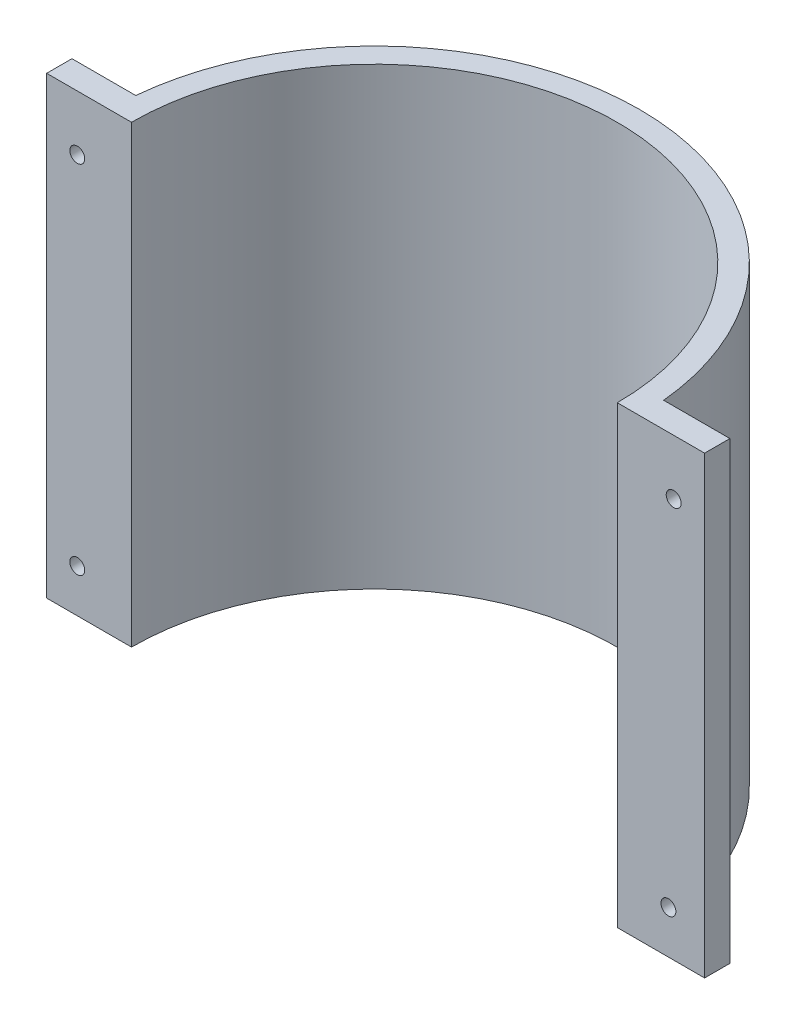
ISO-10303-21;
HEADER;
FILE_DESCRIPTION(('STEP AP214'),'2;1');
FILE_NAME('part.step','',(''),(''),'','','');
FILE_SCHEMA(('AUTOMOTIVE_DESIGN { 1 0 10303 214 1 1 1 1 }'));
ENDSEC;
DATA;
#1=APPLICATION_CONTEXT('core data for automotive mechanical design processes');
#2=APPLICATION_PROTOCOL_DEFINITION('international standard','automotive_design',2000,#1);
#3=PRODUCT_CONTEXT('',#1,'mechanical');
#4=PRODUCT('Part','Part','',(#3));
#5=PRODUCT_RELATED_PRODUCT_CATEGORY('part','',(#4));
#6=PRODUCT_DEFINITION_FORMATION('','',#4);
#7=PRODUCT_DEFINITION_CONTEXT('part definition',#1,'design');
#8=PRODUCT_DEFINITION('design','',#6,#7);
#9=PRODUCT_DEFINITION_SHAPE('','',#8);
#10=(LENGTH_UNIT() NAMED_UNIT(*) SI_UNIT(.MILLI.,.METRE.));
#11=(NAMED_UNIT(*) PLANE_ANGLE_UNIT() SI_UNIT($,.RADIAN.));
#12=(NAMED_UNIT(*) SI_UNIT($,.STERADIAN.) SOLID_ANGLE_UNIT());
#13=UNCERTAINTY_MEASURE_WITH_UNIT(LENGTH_MEASURE(1.E-05),#10,'distance_accuracy_value','');
#14=(GEOMETRIC_REPRESENTATION_CONTEXT(3) GLOBAL_UNCERTAINTY_ASSIGNED_CONTEXT((#13)) GLOBAL_UNIT_ASSIGNED_CONTEXT((#10,
#11,#12)) REPRESENTATION_CONTEXT('',''));
#15=CARTESIAN_POINT('',(0.,0.,0.));
#16=DIRECTION('',(0.,0.,1.));
#17=DIRECTION('',(1.,0.,0.));
#18=AXIS2_PLACEMENT_3D('',#15,#16,#17);
#19=CARTESIAN_POINT('',(0.,76.2,0.));
#20=DIRECTION('',(0.,0.,-1.));
#21=DIRECTION('',(-1.,0.,0.));
#22=AXIS2_PLACEMENT_3D('',#19,#20,#21);
#23=PLANE('',#22);
#24=CARTESIAN_POINT('',(50.1718812238547,66.9453906654637,0.));
#25=DIRECTION('',(0.,0.,-1.));
#26=DIRECTION('',(-1.,0.,0.));
#27=AXIS2_PLACEMENT_3D('',#24,#25,#26);
#28=CIRCLE('',#27,1.25);
#29=CARTESIAN_POINT('',(48.9218812238547,66.9453906654637,0.));
#30=VERTEX_POINT('',#29);
#31=EDGE_CURVE('E238',#30,#30,#28,.T.);
#32=ORIENTED_EDGE('',*,*,#31,.T.);
#33=EDGE_LOOP('',(#32));
#34=FACE_BOUND('',#33,.T.);
#35=CARTESIAN_POINT('',(49.2913811461701,7.23147630612247,0.));
#36=DIRECTION('',(0.,0.,-1.));
#37=DIRECTION('',(-1.,0.,0.));
#38=AXIS2_PLACEMENT_3D('',#35,#36,#37);
#39=CIRCLE('',#38,1.25);
#40=CARTESIAN_POINT('',(48.0413811461701,7.23147630612247,0.));
#41=VERTEX_POINT('',#40);
#42=EDGE_CURVE('E226',#41,#41,#39,.T.);
#43=ORIENTED_EDGE('',*,*,#42,.T.);
#44=EDGE_LOOP('',(#43));
#45=FACE_BOUND('',#44,.T.);
#46=DIRECTION('',(1.,0.,0.));
#47=VECTOR('',#46,1.);
#48=CARTESIAN_POINT('',(0.,0.,0.));
#49=LINE('',#48,#47);
#50=CARTESIAN_POINT('',(40.716846583291,0.,0.));
#51=VERTEX_POINT('',#50);
#52=CARTESIAN_POINT('',(55.3595794015159,0.,0.));
#53=VERTEX_POINT('',#52);
#54=EDGE_CURVE('E108',#51,#53,#49,.T.);
#55=ORIENTED_EDGE('',*,*,#54,.T.);
#56=DIRECTION('',(0.,-1.,0.));
#57=VECTOR('',#56,1.);
#58=CARTESIAN_POINT('',(55.3595794015159,76.2,0.));
#59=LINE('',#58,#57);
#60=CARTESIAN_POINT('',(55.3595794015159,76.2,0.));
#61=VERTEX_POINT('',#60);
#62=EDGE_CURVE('E111',#61,#53,#59,.T.);
#63=ORIENTED_EDGE('',*,*,#62,.F.);
#64=DIRECTION('',(1.,0.,0.));
#65=VECTOR('',#64,1.);
#66=CARTESIAN_POINT('',(0.,76.2,0.));
#67=LINE('',#66,#65);
#68=CARTESIAN_POINT('',(40.716846583291,76.2,0.));
#69=VERTEX_POINT('',#68);
#70=EDGE_CURVE('E163',#69,#61,#67,.T.);
#71=ORIENTED_EDGE('',*,*,#70,.F.);
#72=DIRECTION('',(0.,-1.,0.));
#73=VECTOR('',#72,1.);
#74=CARTESIAN_POINT('',(40.716846583291,76.2,0.));
#75=LINE('',#74,#73);
#76=EDGE_CURVE('E115',#69,#51,#75,.T.);
#77=ORIENTED_EDGE('',*,*,#76,.T.);
#78=EDGE_LOOP('',(#55,#63,#71,#77));
#79=FACE_BOUND('',#78,.T.);
#80=ADVANCED_FACE('F69',(#34,#45,#79),#23,.F.);
#81=CARTESIAN_POINT('',(0.,76.2,0.));
#82=DIRECTION('',(0.,-1.,0.));
#83=DIRECTION('',(0.,0.,-1.));
#84=AXIS2_PLACEMENT_3D('',#81,#82,#83);
#85=CYLINDRICAL_SURFACE('',#84,44.45);
#86=CARTESIAN_POINT('',(0.,76.2,0.));
#87=DIRECTION('',(0.,1.,0.));
#88=DIRECTION('',(0.,0.,1.));
#89=AXIS2_PLACEMENT_3D('',#86,#87,#88);
#90=CIRCLE('',#89,44.45);
#91=CARTESIAN_POINT('',(44.2472010788638,76.2,-4.24119047987651));
#92=VERTEX_POINT('',#91);
#93=CARTESIAN_POINT('',(-44.2472010788638,76.2,-4.24119047987651));
#94=VERTEX_POINT('',#93);
#95=EDGE_CURVE('E119',#92,#94,#90,.T.);
#96=ORIENTED_EDGE('',*,*,#95,.F.);
#97=DIRECTION('',(0.,-1.,0.));
#98=VECTOR('',#97,1.);
#99=CARTESIAN_POINT('',(44.2472010788638,76.2,-4.2411904798765));
#100=LINE('',#99,#98);
#101=CARTESIAN_POINT('',(44.2472010788638,0.,-4.24119047987651));
#102=VERTEX_POINT('',#101);
#103=EDGE_CURVE('E12',#92,#102,#100,.T.);
#104=ORIENTED_EDGE('',*,*,#103,.T.);
#105=CARTESIAN_POINT('',(0.,0.,0.));
#106=DIRECTION('',(0.,1.,0.));
#107=DIRECTION('',(0.,0.,1.));
#108=AXIS2_PLACEMENT_3D('',#105,#106,#107);
#109=CIRCLE('',#108,44.45);
#110=CARTESIAN_POINT('',(-44.2472010788638,0.,-4.24119047987651));
#111=VERTEX_POINT('',#110);
#112=EDGE_CURVE('E130',#102,#111,#109,.T.);
#113=ORIENTED_EDGE('',*,*,#112,.T.);
#114=DIRECTION('',(0.,-1.,0.));
#115=VECTOR('',#114,1.);
#116=CARTESIAN_POINT('',(-44.2472010788638,76.2,-4.24119047987651));
#117=LINE('',#116,#115);
#118=EDGE_CURVE('E79',#94,#111,#117,.T.);
#119=ORIENTED_EDGE('',*,*,#118,.F.);
#120=EDGE_LOOP('',(#96,#104,#113,#119));
#121=FACE_BOUND('',#120,.T.);
#122=ADVANCED_FACE('F274',(#121),#85,.T.);
#123=CARTESIAN_POINT('',(0.,76.2,-4.24119047987651));
#124=DIRECTION('',(0.,0.,1.));
#125=DIRECTION('',(1.,0.,0.));
#126=AXIS2_PLACEMENT_3D('',#123,#124,#125);
#127=PLANE('',#126);
#128=CARTESIAN_POINT('',(-49.8049003241577,7.23147630612247,-4.24119047987651));
#129=DIRECTION('',(0.,0.,-1.));
#130=DIRECTION('',(-1.,0.,0.));
#131=AXIS2_PLACEMENT_3D('',#128,#129,#130);
#132=CIRCLE('',#131,1.275);
#133=CARTESIAN_POINT('',(-51.0799003241577,7.23147630612247,-4.24119047987651));
#134=VERTEX_POINT('',#133);
#135=EDGE_CURVE('E222',#134,#134,#132,.T.);
#136=ORIENTED_EDGE('',*,*,#135,.F.);
#137=EDGE_LOOP('',(#136));
#138=FACE_BOUND('',#137,.T.);
#139=CARTESIAN_POINT('',(-49.8049003241577,66.9453906654637,-4.24119047987651));
#140=DIRECTION('',(0.,0.,-1.));
#141=DIRECTION('',(-1.,0.,0.));
#142=AXIS2_PLACEMENT_3D('',#139,#140,#141);
#143=CIRCLE('',#142,1.275);
#144=CARTESIAN_POINT('',(-51.0799003241577,66.9453906654637,-4.24119047987651));
#145=VERTEX_POINT('',#144);
#146=EDGE_CURVE('E210',#145,#145,#143,.T.);
#147=ORIENTED_EDGE('',*,*,#146,.F.);
#148=EDGE_LOOP('',(#147));
#149=FACE_BOUND('',#148,.T.);
#150=DIRECTION('',(-1.,0.,0.));
#151=VECTOR('',#150,1.);
#152=CARTESIAN_POINT('',(0.,0.,-4.24119047987651));
#153=LINE('',#152,#151);
#154=CARTESIAN_POINT('',(-54.9362177945739,0.,-4.24119047987651));
#155=VERTEX_POINT('',#154);
#156=EDGE_CURVE('E175',#111,#155,#153,.T.);
#157=ORIENTED_EDGE('',*,*,#156,.T.);
#158=DIRECTION('',(0.,-1.,0.));
#159=VECTOR('',#158,1.);
#160=CARTESIAN_POINT('',(-54.9362177945739,76.2,-4.24119047987651));
#161=LINE('',#160,#159);
#162=CARTESIAN_POINT('',(-54.9362177945739,76.2,-4.24119047987651));
#163=VERTEX_POINT('',#162);
#164=EDGE_CURVE('E150',#163,#155,#161,.T.);
#165=ORIENTED_EDGE('',*,*,#164,.F.);
#166=DIRECTION('',(-1.,0.,0.));
#167=VECTOR('',#166,1.);
#168=CARTESIAN_POINT('',(0.,76.2,-4.24119047987651));
#169=LINE('',#168,#167);
#170=EDGE_CURVE('E196',#94,#163,#169,.T.);
#171=ORIENTED_EDGE('',*,*,#170,.F.);
#172=ORIENTED_EDGE('',*,*,#118,.T.);
#173=EDGE_LOOP('',(#157,#165,#171,#172));
#174=FACE_BOUND('',#173,.T.);
#175=ADVANCED_FACE('F276',(#138,#149,#174),#127,.F.);
#176=CARTESIAN_POINT('',(-54.9362177945739,76.2,0.));
#177=DIRECTION('',(-1.,0.,0.));
#178=DIRECTION('',(0.,0.,1.));
#179=AXIS2_PLACEMENT_3D('',#176,#177,#178);
#180=PLANE('',#179);
#181=DIRECTION('',(0.,0.,-1.));
#182=VECTOR('',#181,1.);
#183=CARTESIAN_POINT('',(-54.9362177945739,0.,0.));
#184=LINE('',#183,#182);
#185=CARTESIAN_POINT('',(-54.9362177945739,0.,0.));
#186=VERTEX_POINT('',#185);
#187=EDGE_CURVE('E171',#186,#155,#184,.T.);
#188=ORIENTED_EDGE('',*,*,#187,.F.);
#189=DIRECTION('',(0.,-1.,0.));
#190=VECTOR('',#189,1.);
#191=CARTESIAN_POINT('',(-54.9362177945739,76.2,0.));
#192=LINE('',#191,#190);
#193=CARTESIAN_POINT('',(-54.9362177945739,76.2,0.));
#194=VERTEX_POINT('',#193);
#195=EDGE_CURVE('E154',#194,#186,#192,.T.);
#196=ORIENTED_EDGE('',*,*,#195,.F.);
#197=DIRECTION('',(0.,0.,-1.));
#198=VECTOR('',#197,1.);
#199=CARTESIAN_POINT('',(-54.9362177945739,76.2,0.));
#200=LINE('',#199,#198);
#201=EDGE_CURVE('E192',#194,#163,#200,.T.);
#202=ORIENTED_EDGE('',*,*,#201,.T.);
#203=ORIENTED_EDGE('',*,*,#164,.T.);
#204=EDGE_LOOP('',(#188,#196,#202,#203));
#205=FACE_BOUND('',#204,.T.);
#206=ADVANCED_FACE('F283',(#205),#180,.T.);
#207=CARTESIAN_POINT('',(0.,76.2,0.));
#208=DIRECTION('',(0.,0.,-1.));
#209=DIRECTION('',(-1.,0.,0.));
#210=AXIS2_PLACEMENT_3D('',#207,#208,#209);
#211=PLANE('',#210);
#212=CARTESIAN_POINT('',(-49.8049003241577,7.23147630612247,0.));
#213=DIRECTION('',(0.,0.,-1.));
#214=DIRECTION('',(-1.,0.,0.));
#215=AXIS2_PLACEMENT_3D('',#212,#213,#214);
#216=CIRCLE('',#215,1.25);
#217=CARTESIAN_POINT('',(-51.0549003241577,7.23147630612247,0.));
#218=VERTEX_POINT('',#217);
#219=EDGE_CURVE('E214',#218,#218,#216,.T.);
#220=ORIENTED_EDGE('',*,*,#219,.T.);
#221=EDGE_LOOP('',(#220));
#222=FACE_BOUND('',#221,.T.);
#223=CARTESIAN_POINT('',(-49.8049003241577,66.9453906654637,0.));
#224=DIRECTION('',(0.,0.,-1.));
#225=DIRECTION('',(-1.,0.,0.));
#226=AXIS2_PLACEMENT_3D('',#223,#224,#225);
#227=CIRCLE('',#226,1.25);
#228=CARTESIAN_POINT('',(-51.0549003241577,66.9453906654637,0.));
#229=VERTEX_POINT('',#228);
#230=EDGE_CURVE('E140',#229,#229,#227,.T.);
#231=ORIENTED_EDGE('',*,*,#230,.T.);
#232=EDGE_LOOP('',(#231));
#233=FACE_BOUND('',#232,.T.);
#234=DIRECTION('',(1.,0.,0.));
#235=VECTOR('',#234,1.);
#236=CARTESIAN_POINT('',(0.,0.,0.));
#237=LINE('',#236,#235);
#238=CARTESIAN_POINT('',(-40.716846583291,0.,0.));
#239=VERTEX_POINT('',#238);
#240=EDGE_CURVE('E167',#186,#239,#237,.T.);
#241=ORIENTED_EDGE('',*,*,#240,.T.);
#242=DIRECTION('',(0.,-1.,0.));
#243=VECTOR('',#242,1.);
#244=CARTESIAN_POINT('',(-40.716846583291,76.2,0.));
#245=LINE('',#244,#243);
#246=CARTESIAN_POINT('',(-40.716846583291,76.2,0.));
#247=VERTEX_POINT('',#246);
#248=EDGE_CURVE('E158',#247,#239,#245,.T.);
#249=ORIENTED_EDGE('',*,*,#248,.F.);
#250=DIRECTION('',(1.,0.,0.));
#251=VECTOR('',#250,1.);
#252=CARTESIAN_POINT('',(0.,76.2,0.));
#253=LINE('',#252,#251);
#254=EDGE_CURVE('E188',#194,#247,#253,.T.);
#255=ORIENTED_EDGE('',*,*,#254,.F.);
#256=ORIENTED_EDGE('',*,*,#195,.T.);
#257=EDGE_LOOP('',(#241,#249,#255,#256));
#258=FACE_BOUND('',#257,.T.);
#259=ADVANCED_FACE('F307',(#222,#233,#258),#211,.F.);
#260=CARTESIAN_POINT('',(0.,76.2,0.));
#261=DIRECTION('',(0.,-1.,0.));
#262=DIRECTION('',(0.,0.,-1.));
#263=AXIS2_PLACEMENT_3D('',#260,#261,#262);
#264=CYLINDRICAL_SURFACE('',#263,40.716846583291);
#265=CARTESIAN_POINT('',(0.,0.,0.));
#266=DIRECTION('',(0.,1.,0.));
#267=DIRECTION('',(0.,0.,1.));
#268=AXIS2_PLACEMENT_3D('',#265,#266,#267);
#269=CIRCLE('',#268,40.716846583291);
#270=EDGE_CURVE('E120',#51,#239,#269,.T.);
#271=ORIENTED_EDGE('',*,*,#270,.F.);
#272=ORIENTED_EDGE('',*,*,#76,.F.);
#273=CARTESIAN_POINT('',(0.,76.2,0.));
#274=DIRECTION('',(0.,1.,0.));
#275=DIRECTION('',(0.,0.,1.));
#276=AXIS2_PLACEMENT_3D('',#273,#274,#275);
#277=CIRCLE('',#276,40.716846583291);
#278=EDGE_CURVE('E184',#69,#247,#277,.T.);
#279=ORIENTED_EDGE('',*,*,#278,.T.);
#280=ORIENTED_EDGE('',*,*,#248,.T.);
#281=EDGE_LOOP('',(#271,#272,#279,#280));
#282=FACE_BOUND('',#281,.T.);
#283=ADVANCED_FACE('F299',(#282),#264,.F.);
#284=CARTESIAN_POINT('',(0.,0.,0.));
#285=DIRECTION('',(0.,1.,0.));
#286=DIRECTION('',(0.,0.,1.));
#287=AXIS2_PLACEMENT_3D('',#284,#285,#286);
#288=PLANE('',#287);
#289=ORIENTED_EDGE('',*,*,#112,.F.);
#290=DIRECTION('',(1.,0.,0.));
#291=VECTOR('',#290,1.);
#292=CARTESIAN_POINT('',(40.716846583291,0.,-4.24119047987651));
#293=LINE('',#292,#291);
#294=CARTESIAN_POINT('',(55.3595794015159,0.,-4.24119047987651));
#295=VERTEX_POINT('',#294);
#296=EDGE_CURVE('E101',#102,#295,#293,.T.);
#297=ORIENTED_EDGE('',*,*,#296,.T.);
#298=DIRECTION('',(0.,0.,-1.));
#299=VECTOR('',#298,1.);
#300=CARTESIAN_POINT('',(55.3595794015159,0.,0.));
#301=LINE('',#300,#299);
#302=EDGE_CURVE('E126',#53,#295,#301,.T.);
#303=ORIENTED_EDGE('',*,*,#302,.F.);
#304=ORIENTED_EDGE('',*,*,#54,.F.);
#305=ORIENTED_EDGE('',*,*,#270,.T.);
#306=ORIENTED_EDGE('',*,*,#240,.F.);
#307=ORIENTED_EDGE('',*,*,#187,.T.);
#308=ORIENTED_EDGE('',*,*,#156,.F.);
#309=EDGE_LOOP('',(#289,#297,#303,#304,#305,#306,#307,#308));
#310=FACE_BOUND('',#309,.T.);
#311=ADVANCED_FACE('F133',(#310),#288,.F.);
#312=CARTESIAN_POINT('',(0.,76.2,0.));
#313=DIRECTION('',(0.,1.,0.));
#314=DIRECTION('',(0.,0.,1.));
#315=AXIS2_PLACEMENT_3D('',#312,#313,#314);
#316=PLANE('',#315);
#317=ORIENTED_EDGE('',*,*,#278,.F.);
#318=ORIENTED_EDGE('',*,*,#70,.T.);
#319=DIRECTION('',(0.,0.,-1.));
#320=VECTOR('',#319,1.);
#321=CARTESIAN_POINT('',(55.3595794015159,76.2,0.));
#322=LINE('',#321,#320);
#323=CARTESIAN_POINT('',(55.3595794015159,76.2,-4.24119047987651));
#324=VERTEX_POINT('',#323);
#325=EDGE_CURVE('E128',#61,#324,#322,.T.);
#326=ORIENTED_EDGE('',*,*,#325,.T.);
#327=DIRECTION('',(1.,0.,0.));
#328=VECTOR('',#327,1.);
#329=CARTESIAN_POINT('',(40.716846583291,76.2,-4.24119047987651));
#330=LINE('',#329,#328);
#331=EDGE_CURVE('E135',#92,#324,#330,.T.);
#332=ORIENTED_EDGE('',*,*,#331,.F.);
#333=ORIENTED_EDGE('',*,*,#95,.T.);
#334=ORIENTED_EDGE('',*,*,#170,.T.);
#335=ORIENTED_EDGE('',*,*,#201,.F.);
#336=ORIENTED_EDGE('',*,*,#254,.T.);
#337=EDGE_LOOP('',(#317,#318,#326,#332,#333,#334,#335,#336));
#338=FACE_BOUND('',#337,.T.);
#339=ADVANCED_FACE('F288',(#338),#316,.T.);
#340=CARTESIAN_POINT('',(55.3595794015159,76.2,0.));
#341=DIRECTION('',(-1.,0.,0.));
#342=DIRECTION('',(0.,0.,1.));
#343=AXIS2_PLACEMENT_3D('',#340,#341,#342);
#344=PLANE('',#343);
#345=ORIENTED_EDGE('',*,*,#302,.T.);
#346=DIRECTION('',(0.,-1.,0.));
#347=VECTOR('',#346,1.);
#348=CARTESIAN_POINT('',(55.3595794015159,76.2,-4.24119047987651));
#349=LINE('',#348,#347);
#350=EDGE_CURVE('E131',#324,#295,#349,.T.);
#351=ORIENTED_EDGE('',*,*,#350,.F.);
#352=ORIENTED_EDGE('',*,*,#325,.F.);
#353=ORIENTED_EDGE('',*,*,#62,.T.);
#354=EDGE_LOOP('',(#345,#351,#352,#353));
#355=FACE_BOUND('',#354,.T.);
#356=ADVANCED_FACE('F124',(#355),#344,.F.);
#357=CARTESIAN_POINT('',(40.716846583291,76.2,-4.24119047987651));
#358=DIRECTION('',(0.,0.,-1.));
#359=DIRECTION('',(-1.,0.,0.));
#360=AXIS2_PLACEMENT_3D('',#357,#358,#359);
#361=PLANE('',#360);
#362=CARTESIAN_POINT('',(50.1718812238547,66.9453906654637,-4.24119047987651));
#363=DIRECTION('',(0.,0.,-1.));
#364=DIRECTION('',(-1.,0.,0.));
#365=AXIS2_PLACEMENT_3D('',#362,#363,#364);
#366=CIRCLE('',#365,1.275);
#367=CARTESIAN_POINT('',(48.8968812238547,66.9453906654637,-4.24119047987651));
#368=VERTEX_POINT('',#367);
#369=EDGE_CURVE('E246',#368,#368,#366,.T.);
#370=ORIENTED_EDGE('',*,*,#369,.F.);
#371=EDGE_LOOP('',(#370));
#372=FACE_BOUND('',#371,.T.);
#373=CARTESIAN_POINT('',(49.2913811461701,7.23147630612247,-4.24119047987651));
#374=DIRECTION('',(0.,0.,-1.));
#375=DIRECTION('',(-1.,0.,0.));
#376=AXIS2_PLACEMENT_3D('',#373,#374,#375);
#377=CIRCLE('',#376,1.275);
#378=CARTESIAN_POINT('',(48.0163811461701,7.23147630612247,-4.24119047987651));
#379=VERTEX_POINT('',#378);
#380=EDGE_CURVE('E234',#379,#379,#377,.T.);
#381=ORIENTED_EDGE('',*,*,#380,.F.);
#382=EDGE_LOOP('',(#381));
#383=FACE_BOUND('',#382,.T.);
#384=ORIENTED_EDGE('',*,*,#103,.F.);
#385=ORIENTED_EDGE('',*,*,#331,.T.);
#386=ORIENTED_EDGE('',*,*,#350,.T.);
#387=ORIENTED_EDGE('',*,*,#296,.F.);
#388=EDGE_LOOP('',(#384,#385,#386,#387));
#389=FACE_BOUND('',#388,.T.);
#390=ADVANCED_FACE('F71',(#372,#383,#389),#361,.T.);
#391=CARTESIAN_POINT('',(-49.8049003241577,66.9453906654637,-4.24119047987651));
#392=DIRECTION('',(0.,0.,-1.));
#393=DIRECTION('',(-1.,0.,0.));
#394=AXIS2_PLACEMENT_3D('',#391,#392,#393);
#395=CYLINDRICAL_SURFACE('',#394,1.25);
#396=ORIENTED_EDGE('',*,*,#230,.F.);
#397=EDGE_LOOP('',(#396));
#398=FACE_BOUND('',#397,.T.);
#399=CARTESIAN_POINT('',(-49.8049003241577,66.9453906654637,-4.21619047987651));
#400=DIRECTION('',(0.,0.,-1.));
#401=DIRECTION('',(-1.,0.,0.));
#402=AXIS2_PLACEMENT_3D('',#399,#400,#401);
#403=CIRCLE('',#402,1.25);
#404=CARTESIAN_POINT('',(-51.0549003241577,66.9453906654637,-4.21619047987651));
#405=VERTEX_POINT('',#404);
#406=EDGE_CURVE('E206',#405,#405,#403,.T.);
#407=ORIENTED_EDGE('',*,*,#406,.T.);
#408=EDGE_LOOP('',(#407));
#409=FACE_BOUND('',#408,.T.);
#410=ADVANCED_FACE('F255',(#398,#409),#395,.F.);
#411=CARTESIAN_POINT('',(-49.8049003241577,66.9453906654637,-4.24119047987651));
#412=DIRECTION('',(0.,0.,-1.));
#413=DIRECTION('',(-1.,0.,0.));
#414=AXIS2_PLACEMENT_3D('',#411,#412,#413);
#415=CONICAL_SURFACE('',#414,1.275,0.785398163397396);
#416=ORIENTED_EDGE('',*,*,#406,.F.);
#417=EDGE_LOOP('',(#416));
#418=FACE_BOUND('',#417,.T.);
#419=ORIENTED_EDGE('',*,*,#146,.T.);
#420=EDGE_LOOP('',(#419));
#421=FACE_BOUND('',#420,.T.);
#422=ADVANCED_FACE('F420',(#418,#421),#415,.F.);
#423=CARTESIAN_POINT('',(-49.8049003241577,7.23147630612247,-4.24119047987651));
#424=DIRECTION('',(0.,0.,-1.));
#425=DIRECTION('',(-1.,0.,0.));
#426=AXIS2_PLACEMENT_3D('',#423,#424,#425);
#427=CYLINDRICAL_SURFACE('',#426,1.25);
#428=ORIENTED_EDGE('',*,*,#219,.F.);
#429=EDGE_LOOP('',(#428));
#430=FACE_BOUND('',#429,.T.);
#431=CARTESIAN_POINT('',(-49.8049003241577,7.23147630612247,-4.21619047987651));
#432=DIRECTION('',(0.,0.,-1.));
#433=DIRECTION('',(-1.,0.,0.));
#434=AXIS2_PLACEMENT_3D('',#431,#432,#433);
#435=CIRCLE('',#434,1.25);
#436=CARTESIAN_POINT('',(-51.0549003241577,7.23147630612247,-4.21619047987651));
#437=VERTEX_POINT('',#436);
#438=EDGE_CURVE('E218',#437,#437,#435,.T.);
#439=ORIENTED_EDGE('',*,*,#438,.T.);
#440=EDGE_LOOP('',(#439));
#441=FACE_BOUND('',#440,.T.);
#442=ADVANCED_FACE('F428',(#430,#441),#427,.F.);
#443=CARTESIAN_POINT('',(-49.8049003241577,7.23147630612247,-4.24119047987651));
#444=DIRECTION('',(0.,0.,-1.));
#445=DIRECTION('',(-1.,0.,0.));
#446=AXIS2_PLACEMENT_3D('',#443,#444,#445);
#447=CONICAL_SURFACE('',#446,1.275,0.785398163397396);
#448=ORIENTED_EDGE('',*,*,#438,.F.);
#449=EDGE_LOOP('',(#448));
#450=FACE_BOUND('',#449,.T.);
#451=ORIENTED_EDGE('',*,*,#135,.T.);
#452=EDGE_LOOP('',(#451));
#453=FACE_BOUND('',#452,.T.);
#454=ADVANCED_FACE('F270',(#450,#453),#447,.F.);
#455=CARTESIAN_POINT('',(49.2913811461701,7.23147630612247,-4.24119047987651));
#456=DIRECTION('',(0.,0.,-1.));
#457=DIRECTION('',(-1.,0.,0.));
#458=AXIS2_PLACEMENT_3D('',#455,#456,#457);
#459=CYLINDRICAL_SURFACE('',#458,1.25);
#460=ORIENTED_EDGE('',*,*,#42,.F.);
#461=EDGE_LOOP('',(#460));
#462=FACE_BOUND('',#461,.T.);
#463=CARTESIAN_POINT('',(49.2913811461701,7.23147630612247,-4.21619047987651));
#464=DIRECTION('',(0.,0.,-1.));
#465=DIRECTION('',(-1.,0.,0.));
#466=AXIS2_PLACEMENT_3D('',#463,#464,#465);
#467=CIRCLE('',#466,1.25);
#468=CARTESIAN_POINT('',(48.0413811461701,7.23147630612247,-4.21619047987651));
#469=VERTEX_POINT('',#468);
#470=EDGE_CURVE('E230',#469,#469,#467,.T.);
#471=ORIENTED_EDGE('',*,*,#470,.T.);
#472=EDGE_LOOP('',(#471));
#473=FACE_BOUND('',#472,.T.);
#474=ADVANCED_FACE('F261',(#462,#473),#459,.F.);
#475=CARTESIAN_POINT('',(49.2913811461701,7.23147630612247,-4.24119047987651));
#476=DIRECTION('',(0.,0.,-1.));
#477=DIRECTION('',(-1.,0.,0.));
#478=AXIS2_PLACEMENT_3D('',#475,#476,#477);
#479=CONICAL_SURFACE('',#478,1.275,0.785398163397396);
#480=ORIENTED_EDGE('',*,*,#470,.F.);
#481=EDGE_LOOP('',(#480));
#482=FACE_BOUND('',#481,.T.);
#483=ORIENTED_EDGE('',*,*,#380,.T.);
#484=EDGE_LOOP('',(#483));
#485=FACE_BOUND('',#484,.T.);
#486=ADVANCED_FACE('F258',(#482,#485),#479,.F.);
#487=CARTESIAN_POINT('',(50.1718812238547,66.9453906654637,-4.24119047987651));
#488=DIRECTION('',(0.,0.,-1.));
#489=DIRECTION('',(-1.,0.,0.));
#490=AXIS2_PLACEMENT_3D('',#487,#488,#489);
#491=CYLINDRICAL_SURFACE('',#490,1.25);
#492=ORIENTED_EDGE('',*,*,#31,.F.);
#493=EDGE_LOOP('',(#492));
#494=FACE_BOUND('',#493,.T.);
#495=CARTESIAN_POINT('',(50.1718812238547,66.9453906654637,-4.21619047987651));
#496=DIRECTION('',(0.,0.,-1.));
#497=DIRECTION('',(-1.,0.,0.));
#498=AXIS2_PLACEMENT_3D('',#495,#496,#497);
#499=CIRCLE('',#498,1.25);
#500=CARTESIAN_POINT('',(48.9218812238547,66.9453906654637,-4.21619047987651));
#501=VERTEX_POINT('',#500);
#502=EDGE_CURVE('E242',#501,#501,#499,.T.);
#503=ORIENTED_EDGE('',*,*,#502,.T.);
#504=EDGE_LOOP('',(#503));
#505=FACE_BOUND('',#504,.T.);
#506=ADVANCED_FACE('F260',(#494,#505),#491,.F.);
#507=CARTESIAN_POINT('',(50.1718812238547,66.9453906654637,-4.24119047987651));
#508=DIRECTION('',(0.,0.,-1.));
#509=DIRECTION('',(-1.,0.,0.));
#510=AXIS2_PLACEMENT_3D('',#507,#508,#509);
#511=CONICAL_SURFACE('',#510,1.275,0.785398163397396);
#512=ORIENTED_EDGE('',*,*,#502,.F.);
#513=EDGE_LOOP('',(#512));
#514=FACE_BOUND('',#513,.T.);
#515=ORIENTED_EDGE('',*,*,#369,.T.);
#516=EDGE_LOOP('',(#515));
#517=FACE_BOUND('',#516,.T.);
#518=ADVANCED_FACE('F251',(#514,#517),#511,.F.);
#519=CLOSED_SHELL('',(#80,#122,#175,#206,#259,#283,#311,#339,#356,#390,#410,#422,#442,#454,#474,
#486,#506,#518));
#520=MANIFOLD_SOLID_BREP('B2',#519);
#521=ADVANCED_BREP_SHAPE_REPRESENTATION('',(#18,#520),#14);
#522=SHAPE_DEFINITION_REPRESENTATION(#9,#521);
ENDSEC;
END-ISO-10303-21;
